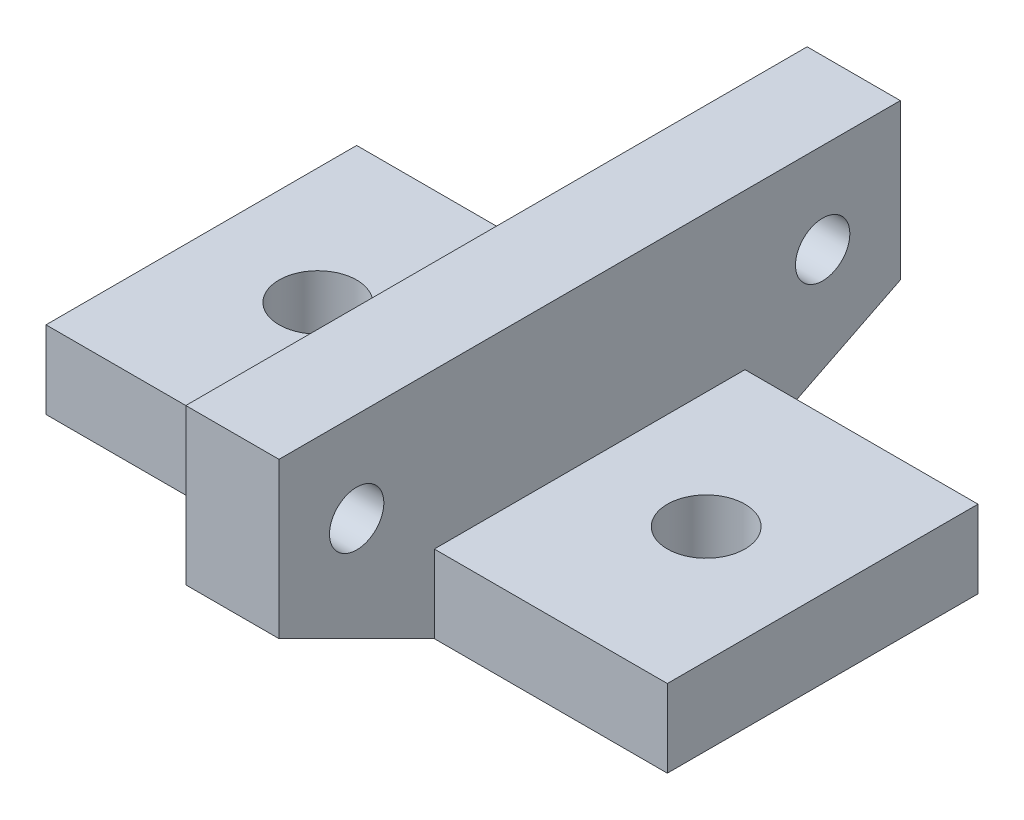
ISO-10303-21;
HEADER;
FILE_DESCRIPTION(('STEP AP214'),'2;1');
FILE_NAME('part.step','',(''),(''),'','','');
FILE_SCHEMA(('AUTOMOTIVE_DESIGN { 1 0 10303 214 1 1 1 1 }'));
ENDSEC;
DATA;
#1=APPLICATION_CONTEXT('core data for automotive mechanical design processes');
#2=APPLICATION_PROTOCOL_DEFINITION('international standard','automotive_design',2000,#1);
#3=PRODUCT_CONTEXT('',#1,'mechanical');
#4=PRODUCT('Part','Part','',(#3));
#5=PRODUCT_RELATED_PRODUCT_CATEGORY('part','',(#4));
#6=PRODUCT_DEFINITION_FORMATION('','',#4);
#7=PRODUCT_DEFINITION_CONTEXT('part definition',#1,'design');
#8=PRODUCT_DEFINITION('design','',#6,#7);
#9=PRODUCT_DEFINITION_SHAPE('','',#8);
#10=(LENGTH_UNIT() NAMED_UNIT(*) SI_UNIT(.MILLI.,.METRE.));
#11=(NAMED_UNIT(*) PLANE_ANGLE_UNIT() SI_UNIT($,.RADIAN.));
#12=(NAMED_UNIT(*) SI_UNIT($,.STERADIAN.) SOLID_ANGLE_UNIT());
#13=UNCERTAINTY_MEASURE_WITH_UNIT(LENGTH_MEASURE(1.E-05),#10,'distance_accuracy_value','');
#14=(GEOMETRIC_REPRESENTATION_CONTEXT(3) GLOBAL_UNCERTAINTY_ASSIGNED_CONTEXT((#13)) GLOBAL_UNIT_ASSIGNED_CONTEXT((#10,
#11,#12)) REPRESENTATION_CONTEXT('',''));
#15=CARTESIAN_POINT('',(0.,0.,0.));
#16=DIRECTION('',(0.,0.,1.));
#17=DIRECTION('',(1.,0.,0.));
#18=AXIS2_PLACEMENT_3D('',#15,#16,#17);
#19=CARTESIAN_POINT('',(-20.,5.,-10.));
#20=DIRECTION('',(0.,0.,1.));
#21=DIRECTION('',(1.,0.,0.));
#22=AXIS2_PLACEMENT_3D('',#19,#20,#21);
#23=PLANE('',#22);
#24=DIRECTION('',(0.,1.,0.));
#25=VECTOR('',#24,1.);
#26=CARTESIAN_POINT('',(-1.,5.,-10.));
#27=LINE('',#26,#25);
#28=CARTESIAN_POINT('',(-1.,0.,-9.99999999999999));
#29=VERTEX_POINT('',#28);
#30=CARTESIAN_POINT('',(-1.,5.,-10.));
#31=VERTEX_POINT('',#30);
#32=EDGE_CURVE('E57',#29,#31,#27,.T.);
#33=ORIENTED_EDGE('',*,*,#32,.F.);
#34=DIRECTION('',(-1.,0.,0.));
#35=VECTOR('',#34,1.);
#36=CARTESIAN_POINT('',(-20.,0.,-10.));
#37=LINE('',#36,#35);
#38=CARTESIAN_POINT('',(-20.,0.,-10.));
#39=VERTEX_POINT('',#38);
#40=EDGE_CURVE('E255',#29,#39,#37,.T.);
#41=ORIENTED_EDGE('',*,*,#40,.T.);
#42=DIRECTION('',(0.,-1.,0.));
#43=VECTOR('',#42,1.);
#44=CARTESIAN_POINT('',(-20.,5.,-10.));
#45=LINE('',#44,#43);
#46=CARTESIAN_POINT('',(-20.,5.,-10.));
#47=VERTEX_POINT('',#46);
#48=EDGE_CURVE('E270',#47,#39,#45,.T.);
#49=ORIENTED_EDGE('',*,*,#48,.F.);
#50=DIRECTION('',(-1.,0.,0.));
#51=VECTOR('',#50,1.);
#52=CARTESIAN_POINT('',(-20.,5.,-10.));
#53=LINE('',#52,#51);
#54=EDGE_CURVE('E157',#31,#47,#53,.T.);
#55=ORIENTED_EDGE('',*,*,#54,.F.);
#56=EDGE_LOOP('',(#33,#41,#49,#55));
#57=FACE_BOUND('',#56,.T.);
#58=ADVANCED_FACE('F39',(#57),#23,.F.);
#59=CARTESIAN_POINT('',(-20.,5.,10.));
#60=DIRECTION('',(0.,0.,-1.));
#61=DIRECTION('',(-1.,0.,0.));
#62=AXIS2_PLACEMENT_3D('',#59,#60,#61);
#63=PLANE('',#62);
#64=DIRECTION('',(0.,1.,0.));
#65=VECTOR('',#64,1.);
#66=CARTESIAN_POINT('',(5.,0.,10.));
#67=LINE('',#66,#65);
#68=CARTESIAN_POINT('',(5.,0.,10.));
#69=VERTEX_POINT('',#68);
#70=CARTESIAN_POINT('',(5.,5.,10.));
#71=VERTEX_POINT('',#70);
#72=EDGE_CURVE('E162',#69,#71,#67,.T.);
#73=ORIENTED_EDGE('',*,*,#72,.F.);
#74=DIRECTION('',(1.,0.,0.));
#75=VECTOR('',#74,1.);
#76=CARTESIAN_POINT('',(-20.,0.,10.));
#77=LINE('',#76,#75);
#78=CARTESIAN_POINT('',(20.,0.,10.));
#79=VERTEX_POINT('',#78);
#80=EDGE_CURVE('E88',#69,#79,#77,.T.);
#81=ORIENTED_EDGE('',*,*,#80,.T.);
#82=DIRECTION('',(0.,-1.,0.));
#83=VECTOR('',#82,1.);
#84=CARTESIAN_POINT('',(20.,5.,10.));
#85=LINE('',#84,#83);
#86=CARTESIAN_POINT('',(20.,5.,10.));
#87=VERTEX_POINT('',#86);
#88=EDGE_CURVE('E251',#87,#79,#85,.T.);
#89=ORIENTED_EDGE('',*,*,#88,.F.);
#90=DIRECTION('',(1.,0.,0.));
#91=VECTOR('',#90,1.);
#92=CARTESIAN_POINT('',(-20.,5.,10.));
#93=LINE('',#92,#91);
#94=EDGE_CURVE('E66',#71,#87,#93,.T.);
#95=ORIENTED_EDGE('',*,*,#94,.F.);
#96=EDGE_LOOP('',(#73,#81,#89,#95));
#97=FACE_BOUND('',#96,.T.);
#98=ADVANCED_FACE('F302',(#97),#63,.F.);
#99=DIRECTION('',(0.,-1.,0.));
#100=VECTOR('',#99,1.);
#101=CARTESIAN_POINT('',(-0.999999999999997,0.,10.));
#102=LINE('',#101,#100);
#103=CARTESIAN_POINT('',(-0.999999999999997,5.,10.));
#104=VERTEX_POINT('',#103);
#105=CARTESIAN_POINT('',(-0.999999999999996,0.,10.));
#106=VERTEX_POINT('',#105);
#107=EDGE_CURVE('E169',#104,#106,#102,.T.);
#108=ORIENTED_EDGE('',*,*,#107,.F.);
#109=CARTESIAN_POINT('',(-20.,5.,10.));
#110=VERTEX_POINT('',#109);
#111=EDGE_CURVE('E247',#110,#104,#93,.T.);
#112=ORIENTED_EDGE('',*,*,#111,.F.);
#113=DIRECTION('',(0.,-1.,0.));
#114=VECTOR('',#113,1.);
#115=CARTESIAN_POINT('',(-20.,5.,10.));
#116=LINE('',#115,#114);
#117=CARTESIAN_POINT('',(-20.,0.,10.));
#118=VERTEX_POINT('',#117);
#119=EDGE_CURVE('E266',#110,#118,#116,.T.);
#120=ORIENTED_EDGE('',*,*,#119,.T.);
#121=EDGE_CURVE('E243',#118,#106,#77,.T.);
#122=ORIENTED_EDGE('',*,*,#121,.T.);
#123=EDGE_LOOP('',(#108,#112,#120,#122));
#124=FACE_BOUND('',#123,.T.);
#125=ADVANCED_FACE('F307',(#124),#63,.F.);
#126=CARTESIAN_POINT('',(0.,5.,0.));
#127=DIRECTION('',(0.,1.,0.));
#128=DIRECTION('',(0.,0.,1.));
#129=AXIS2_PLACEMENT_3D('',#126,#127,#128);
#130=PLANE('',#129);
#131=DIRECTION('',(0.,0.,-1.));
#132=VECTOR('',#131,1.);
#133=CARTESIAN_POINT('',(4.99999999999999,5.,-20.));
#134=LINE('',#133,#132);
#135=CARTESIAN_POINT('',(5.,5.,-10.));
#136=VERTEX_POINT('',#135);
#137=EDGE_CURVE('E11',#71,#136,#134,.T.);
#138=ORIENTED_EDGE('',*,*,#137,.F.);
#139=ORIENTED_EDGE('',*,*,#94,.T.);
#140=DIRECTION('',(0.,0.,-1.));
#141=VECTOR('',#140,1.);
#142=CARTESIAN_POINT('',(20.,5.,-10.));
#143=LINE('',#142,#141);
#144=CARTESIAN_POINT('',(20.,5.,-10.));
#145=VERTEX_POINT('',#144);
#146=EDGE_CURVE('E153',#87,#145,#143,.T.);
#147=ORIENTED_EDGE('',*,*,#146,.T.);
#148=EDGE_CURVE('E96',#145,#136,#53,.T.);
#149=ORIENTED_EDGE('',*,*,#148,.T.);
#150=EDGE_LOOP('',(#138,#139,#147,#149));
#151=FACE_BOUND('',#150,.T.);
#152=CARTESIAN_POINT('',(12.5,5.,0.));
#153=DIRECTION('',(0.,1.,0.));
#154=DIRECTION('',(0.,0.,1.));
#155=AXIS2_PLACEMENT_3D('',#152,#153,#154);
#156=CIRCLE('',#155,2.5);
#157=CARTESIAN_POINT('',(12.5,5.,2.5));
#158=VERTEX_POINT('',#157);
#159=EDGE_CURVE('E226',#158,#158,#156,.T.);
#160=ORIENTED_EDGE('',*,*,#159,.F.);
#161=EDGE_LOOP('',(#160));
#162=FACE_BOUND('',#161,.T.);
#163=ADVANCED_FACE('F150',(#151,#162),#130,.T.);
#164=DIRECTION('',(0.,0.,1.));
#165=VECTOR('',#164,1.);
#166=CARTESIAN_POINT('',(-1.00000000000001,5.,-20.));
#167=LINE('',#166,#165);
#168=EDGE_CURVE('E49',#31,#104,#167,.T.);
#169=ORIENTED_EDGE('',*,*,#168,.F.);
#170=ORIENTED_EDGE('',*,*,#54,.T.);
#171=DIRECTION('',(0.,0.,1.));
#172=VECTOR('',#171,1.);
#173=CARTESIAN_POINT('',(-20.,5.,-10.));
#174=LINE('',#173,#172);
#175=EDGE_CURVE('E156',#47,#110,#174,.T.);
#176=ORIENTED_EDGE('',*,*,#175,.T.);
#177=ORIENTED_EDGE('',*,*,#111,.T.);
#178=EDGE_LOOP('',(#169,#170,#176,#177));
#179=FACE_BOUND('',#178,.T.);
#180=CARTESIAN_POINT('',(-12.5,5.,0.));
#181=DIRECTION('',(0.,1.,0.));
#182=DIRECTION('',(0.,0.,1.));
#183=AXIS2_PLACEMENT_3D('',#180,#181,#182);
#184=CIRCLE('',#183,2.5);
#185=CARTESIAN_POINT('',(-12.5,5.,2.5));
#186=VERTEX_POINT('',#185);
#187=EDGE_CURVE('E234',#186,#186,#184,.T.);
#188=ORIENTED_EDGE('',*,*,#187,.F.);
#189=EDGE_LOOP('',(#188));
#190=FACE_BOUND('',#189,.T.);
#191=ADVANCED_FACE('F323',(#179,#190),#130,.T.);
#192=CARTESIAN_POINT('',(0.,0.,0.));
#193=DIRECTION('',(0.,1.,0.));
#194=DIRECTION('',(0.,0.,1.));
#195=AXIS2_PLACEMENT_3D('',#192,#193,#194);
#196=PLANE('',#195);
#197=DIRECTION('',(0.,0.,-1.));
#198=VECTOR('',#197,1.);
#199=CARTESIAN_POINT('',(20.,0.,-10.));
#200=LINE('',#199,#198);
#201=CARTESIAN_POINT('',(20.,0.,-10.));
#202=VERTEX_POINT('',#201);
#203=EDGE_CURVE('E238',#79,#202,#200,.T.);
#204=ORIENTED_EDGE('',*,*,#203,.F.);
#205=ORIENTED_EDGE('',*,*,#80,.F.);
#206=DIRECTION('',(1.,0.,0.));
#207=VECTOR('',#206,1.);
#208=CARTESIAN_POINT('',(-12.180339887499,0.,10.));
#209=LINE('',#208,#207);
#210=EDGE_CURVE('E165',#106,#69,#209,.T.);
#211=ORIENTED_EDGE('',*,*,#210,.F.);
#212=ORIENTED_EDGE('',*,*,#121,.F.);
#213=DIRECTION('',(0.,0.,1.));
#214=VECTOR('',#213,1.);
#215=CARTESIAN_POINT('',(-20.,0.,-10.));
#216=LINE('',#215,#214);
#217=EDGE_CURVE('E258',#39,#118,#216,.T.);
#218=ORIENTED_EDGE('',*,*,#217,.F.);
#219=ORIENTED_EDGE('',*,*,#40,.F.);
#220=DIRECTION('',(1.,0.,0.));
#221=VECTOR('',#220,1.);
#222=CARTESIAN_POINT('',(-12.180339887499,0.,-9.99999999999999));
#223=LINE('',#222,#221);
#224=CARTESIAN_POINT('',(5.,0.,-9.99999999999999));
#225=VERTEX_POINT('',#224);
#226=EDGE_CURVE('E332',#29,#225,#223,.T.);
#227=ORIENTED_EDGE('',*,*,#226,.T.);
#228=EDGE_CURVE('E143',#202,#225,#37,.T.);
#229=ORIENTED_EDGE('',*,*,#228,.F.);
#230=EDGE_LOOP('',(#204,#205,#211,#212,#218,#219,#227,#229));
#231=FACE_BOUND('',#230,.T.);
#232=CARTESIAN_POINT('',(-12.5,0.,0.));
#233=DIRECTION('',(0.,1.,0.));
#234=DIRECTION('',(0.,0.,1.));
#235=AXIS2_PLACEMENT_3D('',#232,#233,#234);
#236=CIRCLE('',#235,2.5);
#237=CARTESIAN_POINT('',(-12.5,0.,2.5));
#238=VERTEX_POINT('',#237);
#239=EDGE_CURVE('E230',#238,#238,#236,.T.);
#240=ORIENTED_EDGE('',*,*,#239,.T.);
#241=EDGE_LOOP('',(#240));
#242=FACE_BOUND('',#241,.T.);
#243=CARTESIAN_POINT('',(12.5,0.,0.));
#244=DIRECTION('',(0.,1.,0.));
#245=DIRECTION('',(0.,0.,1.));
#246=AXIS2_PLACEMENT_3D('',#243,#244,#245);
#247=CIRCLE('',#246,2.5);
#248=CARTESIAN_POINT('',(12.5,0.,2.5));
#249=VERTEX_POINT('',#248);
#250=EDGE_CURVE('E225',#249,#249,#247,.T.);
#251=ORIENTED_EDGE('',*,*,#250,.T.);
#252=EDGE_LOOP('',(#251));
#253=FACE_BOUND('',#252,.T.);
#254=ADVANCED_FACE('F318',(#231,#242,#253),#196,.F.);
#255=CARTESIAN_POINT('',(20.,5.,-10.));
#256=DIRECTION('',(-1.,0.,0.));
#257=DIRECTION('',(0.,0.,1.));
#258=AXIS2_PLACEMENT_3D('',#255,#256,#257);
#259=PLANE('',#258);
#260=ORIENTED_EDGE('',*,*,#203,.T.);
#261=DIRECTION('',(0.,-1.,0.));
#262=VECTOR('',#261,1.);
#263=CARTESIAN_POINT('',(20.,5.,-10.));
#264=LINE('',#263,#262);
#265=EDGE_CURVE('E207',#145,#202,#264,.T.);
#266=ORIENTED_EDGE('',*,*,#265,.F.);
#267=ORIENTED_EDGE('',*,*,#146,.F.);
#268=ORIENTED_EDGE('',*,*,#88,.T.);
#269=EDGE_LOOP('',(#260,#266,#267,#268));
#270=FACE_BOUND('',#269,.T.);
#271=ADVANCED_FACE('F41',(#270),#259,.F.);
#272=ORIENTED_EDGE('',*,*,#228,.T.);
#273=DIRECTION('',(0.,-1.,0.));
#274=VECTOR('',#273,1.);
#275=CARTESIAN_POINT('',(5.,5.,-10.));
#276=LINE('',#275,#274);
#277=EDGE_CURVE('E141',#136,#225,#276,.T.);
#278=ORIENTED_EDGE('',*,*,#277,.F.);
#279=ORIENTED_EDGE('',*,*,#148,.F.);
#280=ORIENTED_EDGE('',*,*,#265,.T.);
#281=EDGE_LOOP('',(#272,#278,#279,#280));
#282=FACE_BOUND('',#281,.T.);
#283=ADVANCED_FACE('F142',(#282),#23,.F.);
#284=CARTESIAN_POINT('',(-20.,5.,-10.));
#285=DIRECTION('',(1.,0.,0.));
#286=DIRECTION('',(0.,0.,-1.));
#287=AXIS2_PLACEMENT_3D('',#284,#285,#286);
#288=PLANE('',#287);
#289=ORIENTED_EDGE('',*,*,#217,.T.);
#290=ORIENTED_EDGE('',*,*,#119,.F.);
#291=ORIENTED_EDGE('',*,*,#175,.F.);
#292=ORIENTED_EDGE('',*,*,#48,.T.);
#293=EDGE_LOOP('',(#289,#290,#291,#292));
#294=FACE_BOUND('',#293,.T.);
#295=ADVANCED_FACE('F311',(#294),#288,.F.);
#296=CARTESIAN_POINT('',(-12.5,5.,0.));
#297=DIRECTION('',(0.,-1.,0.));
#298=DIRECTION('',(0.,0.,-1.));
#299=AXIS2_PLACEMENT_3D('',#296,#297,#298);
#300=CYLINDRICAL_SURFACE('',#299,2.5);
#301=ORIENTED_EDGE('',*,*,#187,.T.);
#302=EDGE_LOOP('',(#301));
#303=FACE_BOUND('',#302,.T.);
#304=ORIENTED_EDGE('',*,*,#239,.F.);
#305=EDGE_LOOP('',(#304));
#306=FACE_BOUND('',#305,.T.);
#307=ADVANCED_FACE('F316',(#303,#306),#300,.F.);
#308=CARTESIAN_POINT('',(12.5,5.,0.));
#309=DIRECTION('',(0.,-1.,0.));
#310=DIRECTION('',(0.,0.,-1.));
#311=AXIS2_PLACEMENT_3D('',#308,#309,#310);
#312=CYLINDRICAL_SURFACE('',#311,2.5);
#313=ORIENTED_EDGE('',*,*,#159,.T.);
#314=EDGE_LOOP('',(#313));
#315=FACE_BOUND('',#314,.T.);
#316=ORIENTED_EDGE('',*,*,#250,.F.);
#317=EDGE_LOOP('',(#316));
#318=FACE_BOUND('',#317,.T.);
#319=ADVANCED_FACE('F367',(#315,#318),#312,.F.);
#320=CARTESIAN_POINT('',(4.99999999999999,15.,-20.));
#321=DIRECTION('',(-1.,0.,0.));
#322=DIRECTION('',(0.,0.,1.));
#323=AXIS2_PLACEMENT_3D('',#320,#321,#322);
#324=PLANE('',#323);
#325=CARTESIAN_POINT('',(5.,9.2,15.));
#326=DIRECTION('',(1.,0.,0.));
#327=DIRECTION('',(0.,0.,-1.));
#328=AXIS2_PLACEMENT_3D('',#325,#326,#327);
#329=CIRCLE('',#328,1.75);
#330=CARTESIAN_POINT('',(5.,9.2,13.25));
#331=VERTEX_POINT('',#330);
#332=EDGE_CURVE('E178',#331,#331,#329,.T.);
#333=ORIENTED_EDGE('',*,*,#332,.F.);
#334=EDGE_LOOP('',(#333));
#335=FACE_BOUND('',#334,.T.);
#336=CARTESIAN_POINT('',(5.,9.2,-15.));
#337=DIRECTION('',(1.,0.,0.));
#338=DIRECTION('',(0.,0.,-1.));
#339=AXIS2_PLACEMENT_3D('',#336,#337,#338);
#340=CIRCLE('',#339,1.75);
#341=CARTESIAN_POINT('',(4.99999999999999,9.2,-16.75));
#342=VERTEX_POINT('',#341);
#343=EDGE_CURVE('E177',#342,#342,#340,.T.);
#344=ORIENTED_EDGE('',*,*,#343,.F.);
#345=EDGE_LOOP('',(#344));
#346=FACE_BOUND('',#345,.T.);
#347=DIRECTION('',(0.,-1.,0.));
#348=VECTOR('',#347,1.);
#349=CARTESIAN_POINT('',(5.00000000000001,15.,20.));
#350=LINE('',#349,#348);
#351=CARTESIAN_POINT('',(5.00000000000001,15.,20.));
#352=VERTEX_POINT('',#351);
#353=CARTESIAN_POINT('',(5.00000000000001,5.,20.));
#354=VERTEX_POINT('',#353);
#355=EDGE_CURVE('E199',#352,#354,#350,.T.);
#356=ORIENTED_EDGE('',*,*,#355,.T.);
#357=DIRECTION('',(0.,-0.447213595499958,-0.894427190999916));
#358=VECTOR('',#357,1.);
#359=CARTESIAN_POINT('',(5.00000000000001,5.,20.));
#360=LINE('',#359,#358);
#361=EDGE_CURVE('E163',#354,#69,#360,.T.);
#362=ORIENTED_EDGE('',*,*,#361,.T.);
#363=ORIENTED_EDGE('',*,*,#72,.T.);
#364=ORIENTED_EDGE('',*,*,#137,.T.);
#365=ORIENTED_EDGE('',*,*,#277,.T.);
#366=DIRECTION('',(0.,0.447213595499958,-0.894427190999916));
#367=VECTOR('',#366,1.);
#368=CARTESIAN_POINT('',(5.,0.,-9.99999999999999));
#369=LINE('',#368,#367);
#370=CARTESIAN_POINT('',(4.99999999999999,5.,-20.));
#371=VERTEX_POINT('',#370);
#372=EDGE_CURVE('E148',#225,#371,#369,.T.);
#373=ORIENTED_EDGE('',*,*,#372,.T.);
#374=DIRECTION('',(0.,-1.,0.));
#375=VECTOR('',#374,1.);
#376=CARTESIAN_POINT('',(4.99999999999999,15.,-20.));
#377=LINE('',#376,#375);
#378=CARTESIAN_POINT('',(4.99999999999999,15.,-20.));
#379=VERTEX_POINT('',#378);
#380=EDGE_CURVE('E221',#379,#371,#377,.T.);
#381=ORIENTED_EDGE('',*,*,#380,.F.);
#382=DIRECTION('',(0.,0.,-1.));
#383=VECTOR('',#382,1.);
#384=CARTESIAN_POINT('',(4.99999999999999,15.,-20.));
#385=LINE('',#384,#383);
#386=EDGE_CURVE('E186',#352,#379,#385,.T.);
#387=ORIENTED_EDGE('',*,*,#386,.F.);
#388=EDGE_LOOP('',(#356,#362,#363,#364,#365,#373,#381,#387));
#389=FACE_BOUND('',#388,.T.);
#390=ADVANCED_FACE('F160',(#335,#346,#389),#324,.F.);
#391=CARTESIAN_POINT('',(-1.00000000000001,15.,-20.));
#392=DIRECTION('',(0.,0.,1.));
#393=DIRECTION('',(1.,0.,0.));
#394=AXIS2_PLACEMENT_3D('',#391,#392,#393);
#395=PLANE('',#394);
#396=DIRECTION('',(-1.,0.,0.));
#397=VECTOR('',#396,1.);
#398=CARTESIAN_POINT('',(-1.00000000000001,5.,-20.));
#399=LINE('',#398,#397);
#400=CARTESIAN_POINT('',(-1.00000000000001,5.,-20.));
#401=VERTEX_POINT('',#400);
#402=EDGE_CURVE('E201',#371,#401,#399,.T.);
#403=ORIENTED_EDGE('',*,*,#402,.T.);
#404=DIRECTION('',(0.,-1.,0.));
#405=VECTOR('',#404,1.);
#406=CARTESIAN_POINT('',(-1.00000000000001,15.,-20.));
#407=LINE('',#406,#405);
#408=CARTESIAN_POINT('',(-1.00000000000001,15.,-20.));
#409=VERTEX_POINT('',#408);
#410=EDGE_CURVE('E217',#409,#401,#407,.T.);
#411=ORIENTED_EDGE('',*,*,#410,.F.);
#412=DIRECTION('',(-1.,0.,0.));
#413=VECTOR('',#412,1.);
#414=CARTESIAN_POINT('',(-1.00000000000001,15.,-20.));
#415=LINE('',#414,#413);
#416=EDGE_CURVE('E190',#379,#409,#415,.T.);
#417=ORIENTED_EDGE('',*,*,#416,.F.);
#418=ORIENTED_EDGE('',*,*,#380,.T.);
#419=EDGE_LOOP('',(#403,#411,#417,#418));
#420=FACE_BOUND('',#419,.T.);
#421=ADVANCED_FACE('F379',(#420),#395,.F.);
#422=CARTESIAN_POINT('',(-1.00000000000001,15.,-20.));
#423=DIRECTION('',(1.,0.,0.));
#424=DIRECTION('',(0.,0.,-1.));
#425=AXIS2_PLACEMENT_3D('',#422,#423,#424);
#426=PLANE('',#425);
#427=CARTESIAN_POINT('',(-0.999999999999996,9.2,15.));
#428=DIRECTION('',(1.,0.,0.));
#429=DIRECTION('',(0.,0.,-1.));
#430=AXIS2_PLACEMENT_3D('',#427,#428,#429);
#431=CIRCLE('',#430,1.75);
#432=CARTESIAN_POINT('',(-0.999999999999996,9.2,13.25));
#433=VERTEX_POINT('',#432);
#434=EDGE_CURVE('E43',#433,#433,#431,.T.);
#435=ORIENTED_EDGE('',*,*,#434,.T.);
#436=EDGE_LOOP('',(#435));
#437=FACE_BOUND('',#436,.T.);
#438=CARTESIAN_POINT('',(-1.,9.2,-15.));
#439=DIRECTION('',(1.,0.,0.));
#440=DIRECTION('',(0.,0.,-1.));
#441=AXIS2_PLACEMENT_3D('',#438,#439,#440);
#442=CIRCLE('',#441,1.75);
#443=CARTESIAN_POINT('',(-1.,9.2,-16.75));
#444=VERTEX_POINT('',#443);
#445=EDGE_CURVE('E182',#444,#444,#442,.T.);
#446=ORIENTED_EDGE('',*,*,#445,.T.);
#447=EDGE_LOOP('',(#446));
#448=FACE_BOUND('',#447,.T.);
#449=ORIENTED_EDGE('',*,*,#410,.T.);
#450=DIRECTION('',(0.,-0.447213595499958,0.894427190999916));
#451=VECTOR('',#450,1.);
#452=CARTESIAN_POINT('',(-1.,0.,-9.99999999999999));
#453=LINE('',#452,#451);
#454=EDGE_CURVE('E336',#401,#29,#453,.T.);
#455=ORIENTED_EDGE('',*,*,#454,.T.);
#456=ORIENTED_EDGE('',*,*,#32,.T.);
#457=ORIENTED_EDGE('',*,*,#168,.T.);
#458=ORIENTED_EDGE('',*,*,#107,.T.);
#459=DIRECTION('',(0.,0.447213595499958,0.894427190999916));
#460=VECTOR('',#459,1.);
#461=CARTESIAN_POINT('',(-0.999999999999994,5.,20.));
#462=LINE('',#461,#460);
#463=CARTESIAN_POINT('',(-0.999999999999994,5.,20.));
#464=VERTEX_POINT('',#463);
#465=EDGE_CURVE('E174',#106,#464,#462,.T.);
#466=ORIENTED_EDGE('',*,*,#465,.T.);
#467=DIRECTION('',(0.,-1.,0.));
#468=VECTOR('',#467,1.);
#469=CARTESIAN_POINT('',(-0.999999999999994,15.,20.));
#470=LINE('',#469,#468);
#471=CARTESIAN_POINT('',(-0.999999999999994,15.,20.));
#472=VERTEX_POINT('',#471);
#473=EDGE_CURVE('E213',#472,#464,#470,.T.);
#474=ORIENTED_EDGE('',*,*,#473,.F.);
#475=DIRECTION('',(0.,0.,1.));
#476=VECTOR('',#475,1.);
#477=CARTESIAN_POINT('',(-1.00000000000001,15.,-20.));
#478=LINE('',#477,#476);
#479=EDGE_CURVE('E194',#409,#472,#478,.T.);
#480=ORIENTED_EDGE('',*,*,#479,.F.);
#481=EDGE_LOOP('',(#449,#455,#456,#457,#458,#466,#474,#480));
#482=FACE_BOUND('',#481,.T.);
#483=ADVANCED_FACE('F283',(#437,#448,#482),#426,.F.);
#484=CARTESIAN_POINT('',(-0.999999999999994,15.,20.));
#485=DIRECTION('',(0.,0.,-1.));
#486=DIRECTION('',(-1.,0.,0.));
#487=AXIS2_PLACEMENT_3D('',#484,#485,#486);
#488=PLANE('',#487);
#489=DIRECTION('',(1.,0.,0.));
#490=VECTOR('',#489,1.);
#491=CARTESIAN_POINT('',(-0.999999999999994,5.,20.));
#492=LINE('',#491,#490);
#493=EDGE_CURVE('E191',#464,#354,#492,.T.);
#494=ORIENTED_EDGE('',*,*,#493,.T.);
#495=ORIENTED_EDGE('',*,*,#355,.F.);
#496=DIRECTION('',(1.,0.,0.));
#497=VECTOR('',#496,1.);
#498=CARTESIAN_POINT('',(-0.999999999999994,15.,20.));
#499=LINE('',#498,#497);
#500=EDGE_CURVE('E197',#472,#352,#499,.T.);
#501=ORIENTED_EDGE('',*,*,#500,.F.);
#502=ORIENTED_EDGE('',*,*,#473,.T.);
#503=EDGE_LOOP('',(#494,#495,#501,#502));
#504=FACE_BOUND('',#503,.T.);
#505=ADVANCED_FACE('F388',(#504),#488,.F.);
#506=CARTESIAN_POINT('',(0.,15.,0.));
#507=DIRECTION('',(0.,1.,0.));
#508=DIRECTION('',(0.,0.,1.));
#509=AXIS2_PLACEMENT_3D('',#506,#507,#508);
#510=PLANE('',#509);
#511=ORIENTED_EDGE('',*,*,#386,.T.);
#512=ORIENTED_EDGE('',*,*,#416,.T.);
#513=ORIENTED_EDGE('',*,*,#479,.T.);
#514=ORIENTED_EDGE('',*,*,#500,.T.);
#515=EDGE_LOOP('',(#511,#512,#513,#514));
#516=FACE_BOUND('',#515,.T.);
#517=ADVANCED_FACE('F298',(#516),#510,.T.);
#518=CARTESIAN_POINT('',(-5.,9.2,-15.));
#519=DIRECTION('',(1.,0.,0.));
#520=DIRECTION('',(0.,0.,-1.));
#521=AXIS2_PLACEMENT_3D('',#518,#519,#520);
#522=CYLINDRICAL_SURFACE('',#521,1.75);
#523=ORIENTED_EDGE('',*,*,#343,.T.);
#524=EDGE_LOOP('',(#523));
#525=FACE_BOUND('',#524,.T.);
#526=ORIENTED_EDGE('',*,*,#445,.F.);
#527=EDGE_LOOP('',(#526));
#528=FACE_BOUND('',#527,.T.);
#529=ADVANCED_FACE('F288',(#525,#528),#522,.F.);
#530=CARTESIAN_POINT('',(-5.,9.2,15.));
#531=DIRECTION('',(1.,0.,0.));
#532=DIRECTION('',(0.,0.,-1.));
#533=AXIS2_PLACEMENT_3D('',#530,#531,#532);
#534=CYLINDRICAL_SURFACE('',#533,1.75);
#535=ORIENTED_EDGE('',*,*,#332,.T.);
#536=EDGE_LOOP('',(#535));
#537=FACE_BOUND('',#536,.T.);
#538=ORIENTED_EDGE('',*,*,#434,.F.);
#539=EDGE_LOOP('',(#538));
#540=FACE_BOUND('',#539,.T.);
#541=ADVANCED_FACE('F285',(#537,#540),#534,.F.);
#542=CARTESIAN_POINT('',(-12.180339887499,5.,20.));
#543=DIRECTION('',(0.,-0.894427190999916,0.447213595499958));
#544=DIRECTION('',(0.,-0.447213595499958,-0.894427190999916));
#545=AXIS2_PLACEMENT_3D('',#542,#543,#544);
#546=PLANE('',#545);
#547=ORIENTED_EDGE('',*,*,#465,.F.);
#548=ORIENTED_EDGE('',*,*,#210,.T.);
#549=ORIENTED_EDGE('',*,*,#361,.F.);
#550=ORIENTED_EDGE('',*,*,#493,.F.);
#551=EDGE_LOOP('',(#547,#548,#549,#550));
#552=FACE_BOUND('',#551,.T.);
#553=ADVANCED_FACE('F287',(#552),#546,.T.);
#554=CARTESIAN_POINT('',(-12.180339887499,0.,-9.99999999999999));
#555=DIRECTION('',(0.,-0.894427190999916,-0.447213595499958));
#556=DIRECTION('',(0.,0.447213595499958,-0.894427190999916));
#557=AXIS2_PLACEMENT_3D('',#554,#555,#556);
#558=PLANE('',#557);
#559=ORIENTED_EDGE('',*,*,#454,.F.);
#560=ORIENTED_EDGE('',*,*,#402,.F.);
#561=ORIENTED_EDGE('',*,*,#372,.F.);
#562=ORIENTED_EDGE('',*,*,#226,.F.);
#563=EDGE_LOOP('',(#559,#560,#561,#562));
#564=FACE_BOUND('',#563,.T.);
#565=ADVANCED_FACE('F295',(#564),#558,.T.);
#566=CLOSED_SHELL('',(#58,#98,#125,#163,#191,#254,#271,#283,#295,#307,#319,#390,#421,#483,#505,
#517,#529,#541,#553,#565));
#567=MANIFOLD_SOLID_BREP('B2',#566);
#568=ADVANCED_BREP_SHAPE_REPRESENTATION('',(#18,#567),#14);
#569=SHAPE_DEFINITION_REPRESENTATION(#9,#568);
ENDSEC;
END-ISO-10303-21;
